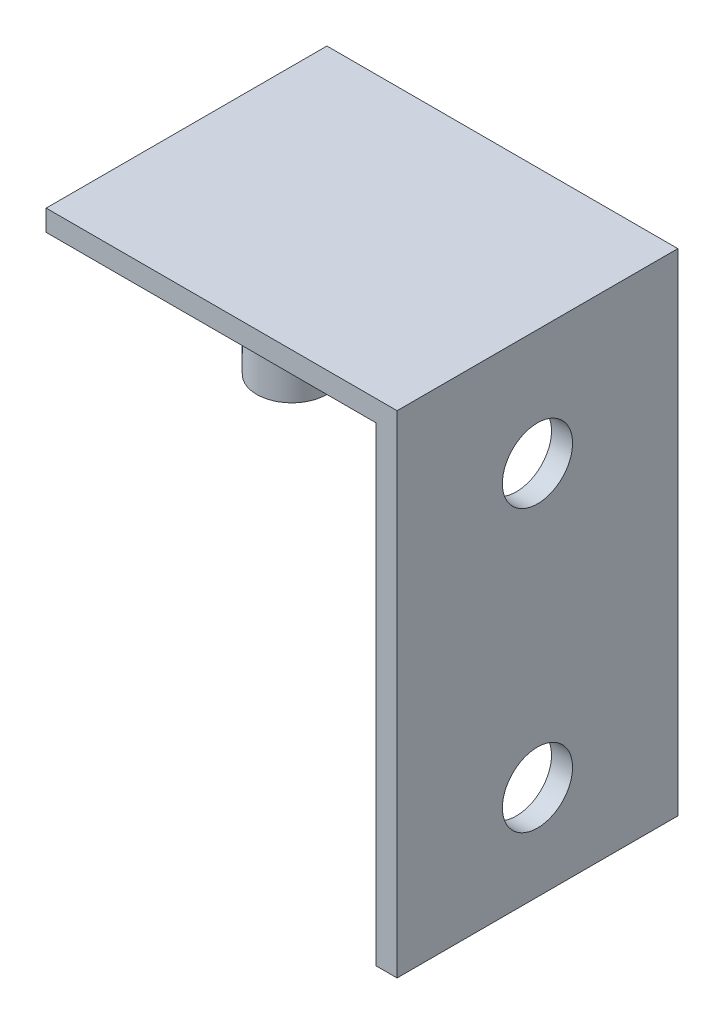
ISO-10303-21;
HEADER;
FILE_DESCRIPTION(('STEP AP214'),'2;1');
FILE_NAME('part.step','',(''),(''),'','','');
FILE_SCHEMA(('AUTOMOTIVE_DESIGN { 1 0 10303 214 1 1 1 1 }'));
ENDSEC;
DATA;
#1=APPLICATION_CONTEXT('core data for automotive mechanical design processes');
#2=APPLICATION_PROTOCOL_DEFINITION('international standard','automotive_design',2000,#1);
#3=PRODUCT_CONTEXT('',#1,'mechanical');
#4=PRODUCT('Part','Part','',(#3));
#5=PRODUCT_RELATED_PRODUCT_CATEGORY('part','',(#4));
#6=PRODUCT_DEFINITION_FORMATION('','',#4);
#7=PRODUCT_DEFINITION_CONTEXT('part definition',#1,'design');
#8=PRODUCT_DEFINITION('design','',#6,#7);
#9=PRODUCT_DEFINITION_SHAPE('','',#8);
#10=(LENGTH_UNIT() NAMED_UNIT(*) SI_UNIT(.MILLI.,.METRE.));
#11=(NAMED_UNIT(*) PLANE_ANGLE_UNIT() SI_UNIT($,.RADIAN.));
#12=(NAMED_UNIT(*) SI_UNIT($,.STERADIAN.) SOLID_ANGLE_UNIT());
#13=UNCERTAINTY_MEASURE_WITH_UNIT(LENGTH_MEASURE(1.E-05),#10,'distance_accuracy_value','');
#14=(GEOMETRIC_REPRESENTATION_CONTEXT(3) GLOBAL_UNCERTAINTY_ASSIGNED_CONTEXT((#13)) GLOBAL_UNIT_ASSIGNED_CONTEXT((#10,
#11,#12)) REPRESENTATION_CONTEXT('',''));
#15=CARTESIAN_POINT('',(0.,0.,0.));
#16=DIRECTION('',(0.,0.,1.));
#17=DIRECTION('',(1.,0.,0.));
#18=AXIS2_PLACEMENT_3D('',#15,#16,#17);
#19=CARTESIAN_POINT('',(0.,0.,0.));
#20=DIRECTION('',(0.,0.,-1.));
#21=DIRECTION('',(-1.,0.,0.));
#22=AXIS2_PLACEMENT_3D('',#19,#20,#21);
#23=PLANE('',#22);
#24=DIRECTION('',(-1.,0.,0.));
#25=VECTOR('',#24,1.);
#26=CARTESIAN_POINT('',(0.,0.,0.));
#27=LINE('',#26,#25);
#28=CARTESIAN_POINT('',(0.,0.,0.));
#29=VERTEX_POINT('',#28);
#30=CARTESIAN_POINT('',(-50.,0.,0.));
#31=VERTEX_POINT('',#30);
#32=EDGE_CURVE('E124',#29,#31,#27,.T.);
#33=ORIENTED_EDGE('',*,*,#32,.F.);
#34=DIRECTION('',(0.,1.,0.));
#35=VECTOR('',#34,1.);
#36=CARTESIAN_POINT('',(0.,0.,0.));
#37=LINE('',#36,#35);
#38=CARTESIAN_POINT('',(0.,-70.,0.));
#39=VERTEX_POINT('',#38);
#40=EDGE_CURVE('E86',#39,#29,#37,.T.);
#41=ORIENTED_EDGE('',*,*,#40,.F.);
#42=DIRECTION('',(1.,0.,0.));
#43=VECTOR('',#42,1.);
#44=CARTESIAN_POINT('',(0.,-70.,0.));
#45=LINE('',#44,#43);
#46=CARTESIAN_POINT('',(-2.99999999999999,-70.,0.));
#47=VERTEX_POINT('',#46);
#48=EDGE_CURVE('E11',#47,#39,#45,.T.);
#49=ORIENTED_EDGE('',*,*,#48,.F.);
#50=DIRECTION('',(0.,1.,0.));
#51=VECTOR('',#50,1.);
#52=CARTESIAN_POINT('',(-3.,0.,0.));
#53=LINE('',#52,#51);
#54=CARTESIAN_POINT('',(-3.,-3.,0.));
#55=VERTEX_POINT('',#54);
#56=EDGE_CURVE('E84',#47,#55,#53,.T.);
#57=ORIENTED_EDGE('',*,*,#56,.T.);
#58=DIRECTION('',(-1.,0.,0.));
#59=VECTOR('',#58,1.);
#60=CARTESIAN_POINT('',(0.,-3.,0.));
#61=LINE('',#60,#59);
#62=CARTESIAN_POINT('',(-50.,-3.00000000000001,0.));
#63=VERTEX_POINT('',#62);
#64=EDGE_CURVE('E108',#55,#63,#61,.T.);
#65=ORIENTED_EDGE('',*,*,#64,.T.);
#66=DIRECTION('',(0.,1.,0.));
#67=VECTOR('',#66,1.);
#68=CARTESIAN_POINT('',(-50.,0.,0.));
#69=LINE('',#68,#67);
#70=EDGE_CURVE('E45',#63,#31,#69,.T.);
#71=ORIENTED_EDGE('',*,*,#70,.T.);
#72=EDGE_LOOP('',(#33,#41,#49,#57,#65,#71));
#73=FACE_BOUND('',#72,.T.);
#74=ADVANCED_FACE('F35',(#73),#23,.T.);
#75=CARTESIAN_POINT('',(-50.,0.,0.));
#76=DIRECTION('',(-1.,0.,0.));
#77=DIRECTION('',(0.,0.,1.));
#78=AXIS2_PLACEMENT_3D('',#75,#76,#77);
#79=PLANE('',#78);
#80=ORIENTED_EDGE('',*,*,#70,.F.);
#81=DIRECTION('',(0.,0.,1.));
#82=VECTOR('',#81,1.);
#83=CARTESIAN_POINT('',(-50.,-3.00000000000001,0.));
#84=LINE('',#83,#82);
#85=CARTESIAN_POINT('',(-50.,-3.00000000000001,40.));
#86=VERTEX_POINT('',#85);
#87=EDGE_CURVE('E135',#63,#86,#84,.T.);
#88=ORIENTED_EDGE('',*,*,#87,.T.);
#89=DIRECTION('',(0.,1.,0.));
#90=VECTOR('',#89,1.);
#91=CARTESIAN_POINT('',(-50.,0.,40.));
#92=LINE('',#91,#90);
#93=CARTESIAN_POINT('',(-50.,0.,40.));
#94=VERTEX_POINT('',#93);
#95=EDGE_CURVE('E111',#86,#94,#92,.T.);
#96=ORIENTED_EDGE('',*,*,#95,.T.);
#97=DIRECTION('',(0.,0.,1.));
#98=VECTOR('',#97,1.);
#99=CARTESIAN_POINT('',(-50.,0.,0.));
#100=LINE('',#99,#98);
#101=EDGE_CURVE('E128',#31,#94,#100,.T.);
#102=ORIENTED_EDGE('',*,*,#101,.F.);
#103=EDGE_LOOP('',(#80,#88,#96,#102));
#104=FACE_BOUND('',#103,.T.);
#105=ADVANCED_FACE('F145',(#104),#79,.T.);
#106=CARTESIAN_POINT('',(0.,0.,40.));
#107=DIRECTION('',(0.,0.,-1.));
#108=DIRECTION('',(0.,1.,0.));
#109=AXIS2_PLACEMENT_3D('',#106,#107,#108);
#110=PLANE('',#109);
#111=DIRECTION('',(0.,1.,0.));
#112=VECTOR('',#111,1.);
#113=CARTESIAN_POINT('',(0.,0.,40.));
#114=LINE('',#113,#112);
#115=CARTESIAN_POINT('',(0.,-70.,40.));
#116=VERTEX_POINT('',#115);
#117=CARTESIAN_POINT('',(0.,0.,40.));
#118=VERTEX_POINT('',#117);
#119=EDGE_CURVE('E121',#116,#118,#114,.T.);
#120=ORIENTED_EDGE('',*,*,#119,.T.);
#121=DIRECTION('',(-1.,0.,0.));
#122=VECTOR('',#121,1.);
#123=CARTESIAN_POINT('',(0.,0.,40.));
#124=LINE('',#123,#122);
#125=EDGE_CURVE('E102',#118,#94,#124,.T.);
#126=ORIENTED_EDGE('',*,*,#125,.T.);
#127=ORIENTED_EDGE('',*,*,#95,.F.);
#128=DIRECTION('',(-1.,0.,0.));
#129=VECTOR('',#128,1.);
#130=CARTESIAN_POINT('',(0.,-3.,40.));
#131=LINE('',#130,#129);
#132=CARTESIAN_POINT('',(-3.,-3.,40.));
#133=VERTEX_POINT('',#132);
#134=EDGE_CURVE('E133',#133,#86,#131,.T.);
#135=ORIENTED_EDGE('',*,*,#134,.F.);
#136=DIRECTION('',(0.,1.,0.));
#137=VECTOR('',#136,1.);
#138=CARTESIAN_POINT('',(-3.,0.,40.));
#139=LINE('',#138,#137);
#140=CARTESIAN_POINT('',(-2.99999999999999,-70.,40.));
#141=VERTEX_POINT('',#140);
#142=EDGE_CURVE('E97',#141,#133,#139,.T.);
#143=ORIENTED_EDGE('',*,*,#142,.F.);
#144=DIRECTION('',(1.,0.,0.));
#145=VECTOR('',#144,1.);
#146=CARTESIAN_POINT('',(0.,-70.,40.));
#147=LINE('',#146,#145);
#148=EDGE_CURVE('E93',#141,#116,#147,.T.);
#149=ORIENTED_EDGE('',*,*,#148,.T.);
#150=EDGE_LOOP('',(#120,#126,#127,#135,#143,#149));
#151=FACE_BOUND('',#150,.T.);
#152=ADVANCED_FACE('F143',(#151),#110,.F.);
#153=CARTESIAN_POINT('',(0.,-70.,0.));
#154=DIRECTION('',(0.,1.,0.));
#155=DIRECTION('',(0.,0.,1.));
#156=AXIS2_PLACEMENT_3D('',#153,#154,#155);
#157=PLANE('',#156);
#158=DIRECTION('',(0.,0.,1.));
#159=VECTOR('',#158,1.);
#160=CARTESIAN_POINT('',(-2.99999999999999,-70.,0.));
#161=LINE('',#160,#159);
#162=EDGE_CURVE('E92',#47,#141,#161,.T.);
#163=ORIENTED_EDGE('',*,*,#162,.F.);
#164=ORIENTED_EDGE('',*,*,#48,.T.);
#165=DIRECTION('',(0.,0.,1.));
#166=VECTOR('',#165,1.);
#167=CARTESIAN_POINT('',(0.,-70.,0.));
#168=LINE('',#167,#166);
#169=EDGE_CURVE('E116',#39,#116,#168,.T.);
#170=ORIENTED_EDGE('',*,*,#169,.T.);
#171=ORIENTED_EDGE('',*,*,#148,.F.);
#172=EDGE_LOOP('',(#163,#164,#170,#171));
#173=FACE_BOUND('',#172,.T.);
#174=ADVANCED_FACE('F37',(#173),#157,.F.);
#175=CARTESIAN_POINT('',(0.,0.,0.));
#176=DIRECTION('',(1.,0.,0.));
#177=DIRECTION('',(0.,1.,0.));
#178=AXIS2_PLACEMENT_3D('',#175,#176,#177);
#179=PLANE('',#178);
#180=CARTESIAN_POINT('',(0.,-16.5,20.));
#181=DIRECTION('',(1.,0.,0.));
#182=DIRECTION('',(0.,1.,0.));
#183=AXIS2_PLACEMENT_3D('',#180,#181,#182);
#184=CIRCLE('',#183,5.);
#185=CARTESIAN_POINT('',(0.,-11.5,20.));
#186=VERTEX_POINT('',#185);
#187=EDGE_CURVE('E184',#186,#186,#184,.T.);
#188=ORIENTED_EDGE('',*,*,#187,.F.);
#189=EDGE_LOOP('',(#188));
#190=FACE_BOUND('',#189,.T.);
#191=CARTESIAN_POINT('',(0.,-56.5,20.));
#192=DIRECTION('',(1.,0.,0.));
#193=DIRECTION('',(0.,1.,0.));
#194=AXIS2_PLACEMENT_3D('',#191,#192,#193);
#195=CIRCLE('',#194,5.);
#196=CARTESIAN_POINT('',(0.,-51.5,20.));
#197=VERTEX_POINT('',#196);
#198=EDGE_CURVE('E183',#197,#197,#195,.T.);
#199=ORIENTED_EDGE('',*,*,#198,.F.);
#200=EDGE_LOOP('',(#199));
#201=FACE_BOUND('',#200,.T.);
#202=ORIENTED_EDGE('',*,*,#119,.F.);
#203=ORIENTED_EDGE('',*,*,#169,.F.);
#204=ORIENTED_EDGE('',*,*,#40,.T.);
#205=DIRECTION('',(0.,0.,1.));
#206=VECTOR('',#205,1.);
#207=CARTESIAN_POINT('',(0.,0.,0.));
#208=LINE('',#207,#206);
#209=EDGE_CURVE('E105',#29,#118,#208,.T.);
#210=ORIENTED_EDGE('',*,*,#209,.T.);
#211=EDGE_LOOP('',(#202,#203,#204,#210));
#212=FACE_BOUND('',#211,.T.);
#213=ADVANCED_FACE('F148',(#190,#201,#212),#179,.T.);
#214=CARTESIAN_POINT('',(0.,0.,0.));
#215=DIRECTION('',(0.,1.,0.));
#216=DIRECTION('',(-1.,0.,0.));
#217=AXIS2_PLACEMENT_3D('',#214,#215,#216);
#218=PLANE('',#217);
#219=ORIENTED_EDGE('',*,*,#125,.F.);
#220=ORIENTED_EDGE('',*,*,#209,.F.);
#221=ORIENTED_EDGE('',*,*,#32,.T.);
#222=ORIENTED_EDGE('',*,*,#101,.T.);
#223=EDGE_LOOP('',(#219,#220,#221,#222));
#224=FACE_BOUND('',#223,.T.);
#225=ADVANCED_FACE('F147',(#224),#218,.T.);
#226=CARTESIAN_POINT('',(-3.,0.,0.));
#227=DIRECTION('',(1.,0.,0.));
#228=DIRECTION('',(0.,1.,0.));
#229=AXIS2_PLACEMENT_3D('',#226,#227,#228);
#230=PLANE('',#229);
#231=CARTESIAN_POINT('',(-3.,-16.5,20.));
#232=DIRECTION('',(-1.,0.,0.));
#233=DIRECTION('',(0.,1.,0.));
#234=AXIS2_PLACEMENT_3D('',#231,#232,#233);
#235=CIRCLE('',#234,5.);
#236=CARTESIAN_POINT('',(-3.,-11.5,20.));
#237=VERTEX_POINT('',#236);
#238=EDGE_CURVE('E178',#237,#237,#235,.T.);
#239=ORIENTED_EDGE('',*,*,#238,.F.);
#240=EDGE_LOOP('',(#239));
#241=FACE_BOUND('',#240,.T.);
#242=CARTESIAN_POINT('',(-2.99999999999999,-56.5,20.));
#243=DIRECTION('',(-1.,0.,0.));
#244=DIRECTION('',(0.,-1.,0.));
#245=AXIS2_PLACEMENT_3D('',#242,#243,#244);
#246=CIRCLE('',#245,5.);
#247=CARTESIAN_POINT('',(-2.99999999999999,-61.5,20.));
#248=VERTEX_POINT('',#247);
#249=EDGE_CURVE('E181',#248,#248,#246,.T.);
#250=ORIENTED_EDGE('',*,*,#249,.F.);
#251=EDGE_LOOP('',(#250));
#252=FACE_BOUND('',#251,.T.);
#253=ORIENTED_EDGE('',*,*,#142,.T.);
#254=DIRECTION('',(0.,0.,1.));
#255=VECTOR('',#254,1.);
#256=CARTESIAN_POINT('',(-3.,-3.,0.));
#257=LINE('',#256,#255);
#258=EDGE_CURVE('E100',#55,#133,#257,.T.);
#259=ORIENTED_EDGE('',*,*,#258,.F.);
#260=ORIENTED_EDGE('',*,*,#56,.F.);
#261=ORIENTED_EDGE('',*,*,#162,.T.);
#262=EDGE_LOOP('',(#253,#259,#260,#261));
#263=FACE_BOUND('',#262,.T.);
#264=ADVANCED_FACE('F99',(#241,#252,#263),#230,.F.);
#265=CARTESIAN_POINT('',(0.,-3.,0.));
#266=DIRECTION('',(0.,1.,0.));
#267=DIRECTION('',(-1.,0.,0.));
#268=AXIS2_PLACEMENT_3D('',#265,#266,#267);
#269=PLANE('',#268);
#270=CARTESIAN_POINT('',(-35.,-3.,20.));
#271=DIRECTION('',(0.,1.,0.));
#272=DIRECTION('',(-1.,0.,0.));
#273=AXIS2_PLACEMENT_3D('',#270,#271,#272);
#274=CIRCLE('',#273,5.);
#275=CARTESIAN_POINT('',(-40.,-3.,20.));
#276=VERTEX_POINT('',#275);
#277=EDGE_CURVE('E39',#276,#276,#274,.T.);
#278=ORIENTED_EDGE('',*,*,#277,.T.);
#279=EDGE_LOOP('',(#278));
#280=FACE_BOUND('',#279,.T.);
#281=ORIENTED_EDGE('',*,*,#134,.T.);
#282=ORIENTED_EDGE('',*,*,#87,.F.);
#283=ORIENTED_EDGE('',*,*,#64,.F.);
#284=ORIENTED_EDGE('',*,*,#258,.T.);
#285=EDGE_LOOP('',(#281,#282,#283,#284));
#286=FACE_BOUND('',#285,.T.);
#287=ADVANCED_FACE('F141',(#280,#286),#269,.F.);
#288=CARTESIAN_POINT('',(-35.,-23.,20.));
#289=DIRECTION('',(0.,1.,0.));
#290=DIRECTION('',(-1.,0.,0.));
#291=AXIS2_PLACEMENT_3D('',#288,#289,#290);
#292=CYLINDRICAL_SURFACE('',#291,5.);
#293=CARTESIAN_POINT('',(-35.,-23.,20.));
#294=DIRECTION('',(0.,1.,0.));
#295=DIRECTION('',(-1.,0.,0.));
#296=AXIS2_PLACEMENT_3D('',#293,#294,#295);
#297=CIRCLE('',#296,5.);
#298=CARTESIAN_POINT('',(-40.,-23.,20.));
#299=VERTEX_POINT('',#298);
#300=EDGE_CURVE('E187',#299,#299,#297,.T.);
#301=ORIENTED_EDGE('',*,*,#300,.T.);
#302=EDGE_LOOP('',(#301));
#303=FACE_BOUND('',#302,.T.);
#304=ORIENTED_EDGE('',*,*,#277,.F.);
#305=EDGE_LOOP('',(#304));
#306=FACE_BOUND('',#305,.T.);
#307=ADVANCED_FACE('F169',(#303,#306),#292,.T.);
#308=CARTESIAN_POINT('',(-35.,-23.,20.));
#309=DIRECTION('',(0.,1.,0.));
#310=DIRECTION('',(-1.,0.,0.));
#311=AXIS2_PLACEMENT_3D('',#308,#309,#310);
#312=PLANE('',#311);
#313=ORIENTED_EDGE('',*,*,#300,.F.);
#314=EDGE_LOOP('',(#313));
#315=FACE_BOUND('',#314,.T.);
#316=ADVANCED_FACE('F199',(#315),#312,.F.);
#317=CARTESIAN_POINT('',(17.,-56.5,20.));
#318=DIRECTION('',(-1.,0.,0.));
#319=DIRECTION('',(0.,-1.,0.));
#320=AXIS2_PLACEMENT_3D('',#317,#318,#319);
#321=CYLINDRICAL_SURFACE('',#320,5.);
#322=ORIENTED_EDGE('',*,*,#198,.T.);
#323=EDGE_LOOP('',(#322));
#324=FACE_BOUND('',#323,.T.);
#325=ORIENTED_EDGE('',*,*,#249,.T.);
#326=EDGE_LOOP('',(#325));
#327=FACE_BOUND('',#326,.T.);
#328=ADVANCED_FACE('F204',(#324,#327),#321,.F.);
#329=CARTESIAN_POINT('',(17.,-16.5,20.));
#330=DIRECTION('',(-1.,0.,0.));
#331=DIRECTION('',(0.,-1.,0.));
#332=AXIS2_PLACEMENT_3D('',#329,#330,#331);
#333=CYLINDRICAL_SURFACE('',#332,5.);
#334=ORIENTED_EDGE('',*,*,#187,.T.);
#335=EDGE_LOOP('',(#334));
#336=FACE_BOUND('',#335,.T.);
#337=ORIENTED_EDGE('',*,*,#238,.T.);
#338=EDGE_LOOP('',(#337));
#339=FACE_BOUND('',#338,.T.);
#340=ADVANCED_FACE('F210',(#336,#339),#333,.F.);
#341=CLOSED_SHELL('',(#74,#105,#152,#174,#213,#225,#264,#287,#307,#316,#328,#340));
#342=MANIFOLD_SOLID_BREP('B2',#341);
#343=ADVANCED_BREP_SHAPE_REPRESENTATION('',(#18,#342),#14);
#344=SHAPE_DEFINITION_REPRESENTATION(#9,#343);
ENDSEC;
END-ISO-10303-21;
